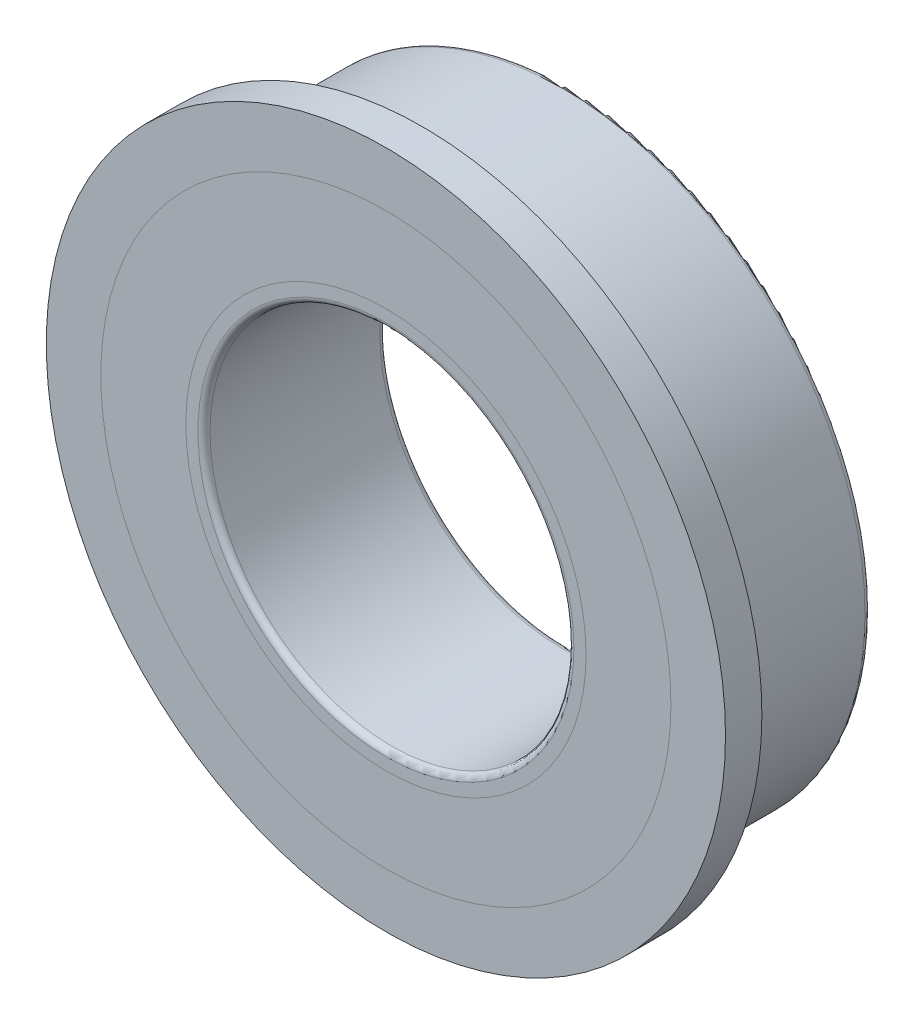
ISO-10303-21;
HEADER;
FILE_DESCRIPTION(('STEP AP214'),'2;1');
FILE_NAME('part.step','',(''),(''),'','','');
FILE_SCHEMA(('AUTOMOTIVE_DESIGN { 1 0 10303 214 1 1 1 1 }'));
ENDSEC;
DATA;
#1=APPLICATION_CONTEXT('core data for automotive mechanical design processes');
#2=APPLICATION_PROTOCOL_DEFINITION('international standard','automotive_design',2000,#1);
#3=PRODUCT_CONTEXT('',#1,'mechanical');
#4=PRODUCT('Part','Part','',(#3));
#5=PRODUCT_RELATED_PRODUCT_CATEGORY('part','',(#4));
#6=PRODUCT_DEFINITION_FORMATION('','',#4);
#7=PRODUCT_DEFINITION_CONTEXT('part definition',#1,'design');
#8=PRODUCT_DEFINITION('design','',#6,#7);
#9=PRODUCT_DEFINITION_SHAPE('','',#8);
#10=(LENGTH_UNIT() NAMED_UNIT(*) SI_UNIT(.MILLI.,.METRE.));
#11=(NAMED_UNIT(*) PLANE_ANGLE_UNIT() SI_UNIT($,.RADIAN.));
#12=(NAMED_UNIT(*) SI_UNIT($,.STERADIAN.) SOLID_ANGLE_UNIT());
#13=UNCERTAINTY_MEASURE_WITH_UNIT(LENGTH_MEASURE(1.E-05),#10,'distance_accuracy_value','');
#14=(GEOMETRIC_REPRESENTATION_CONTEXT(3) GLOBAL_UNCERTAINTY_ASSIGNED_CONTEXT((#13)) GLOBAL_UNIT_ASSIGNED_CONTEXT((#10,
#11,#12)) REPRESENTATION_CONTEXT('',''));
#15=CARTESIAN_POINT('',(0.,0.,0.));
#16=DIRECTION('',(0.,0.,1.));
#17=DIRECTION('',(1.,0.,0.));
#18=AXIS2_PLACEMENT_3D('',#15,#16,#17);
#19=CARTESIAN_POINT('',(0.,0.,0.));
#20=DIRECTION('',(0.,0.,1.));
#21=DIRECTION('',(1.,0.,0.));
#22=AXIS2_PLACEMENT_3D('',#19,#20,#21);
#23=PLANE('',#22);
#24=CARTESIAN_POINT('',(0.,0.,0.));
#25=DIRECTION('',(0.,0.,1.));
#26=DIRECTION('',(1.,0.,0.));
#27=AXIS2_PLACEMENT_3D('',#24,#25,#26);
#28=CIRCLE('',#27,4.9);
#29=CARTESIAN_POINT('',(4.9,0.,0.));
#30=VERTEX_POINT('',#29);
#31=EDGE_CURVE('E75',#30,#30,#28,.F.);
#32=ORIENTED_EDGE('',*,*,#31,.T.);
#33=EDGE_LOOP('',(#32));
#34=FACE_BOUND('',#33,.T.);
#35=CARTESIAN_POINT('',(0.,0.,0.));
#36=DIRECTION('',(0.,0.,1.));
#37=DIRECTION('',(1.,0.,0.));
#38=AXIS2_PLACEMENT_3D('',#35,#36,#37);
#39=CIRCLE('',#38,4.7);
#40=CARTESIAN_POINT('',(4.7,0.,0.));
#41=VERTEX_POINT('',#40);
#42=EDGE_CURVE('E10',#41,#41,#39,.F.);
#43=ORIENTED_EDGE('',*,*,#42,.F.);
#44=EDGE_LOOP('',(#43));
#45=FACE_BOUND('',#44,.T.);
#46=ADVANCED_FACE('F36',(#34,#45),#23,.F.);
#47=CARTESIAN_POINT('',(0.,0.,3.));
#48=DIRECTION('',(0.,0.,1.));
#49=DIRECTION('',(1.,0.,0.));
#50=AXIS2_PLACEMENT_3D('',#47,#48,#49);
#51=PLANE('',#50);
#52=CARTESIAN_POINT('',(0.,0.,3.));
#53=DIRECTION('',(0.,0.,1.));
#54=DIRECTION('',(1.,0.,0.));
#55=AXIS2_PLACEMENT_3D('',#52,#53,#54);
#56=CIRCLE('',#55,5.6);
#57=CARTESIAN_POINT('',(5.6,0.,3.));
#58=VERTEX_POINT('',#57);
#59=EDGE_CURVE('E82',#58,#58,#56,.T.);
#60=ORIENTED_EDGE('',*,*,#59,.T.);
#61=EDGE_LOOP('',(#60));
#62=FACE_BOUND('',#61,.T.);
#63=CARTESIAN_POINT('',(0.,0.,3.));
#64=DIRECTION('',(0.,0.,1.));
#65=DIRECTION('',(1.,0.,0.));
#66=AXIS2_PLACEMENT_3D('',#63,#64,#65);
#67=CIRCLE('',#66,4.7);
#68=CARTESIAN_POINT('',(4.7,0.,3.));
#69=VERTEX_POINT('',#68);
#70=EDGE_CURVE('E40',#69,#69,#67,.F.);
#71=ORIENTED_EDGE('',*,*,#70,.T.);
#72=EDGE_LOOP('',(#71));
#73=FACE_BOUND('',#72,.T.);
#74=ADVANCED_FACE('F111',(#62,#73),#51,.T.);
#75=ORIENTED_EDGE('',*,*,#42,.T.);
#76=EDGE_LOOP('',(#75));
#77=FACE_BOUND('',#76,.T.);
#78=CARTESIAN_POINT('',(0.,0.,0.));
#79=DIRECTION('',(0.,0.,1.));
#80=DIRECTION('',(1.,0.,0.));
#81=AXIS2_PLACEMENT_3D('',#78,#79,#80);
#82=CIRCLE('',#81,3.3);
#83=CARTESIAN_POINT('',(3.3,0.,0.));
#84=VERTEX_POINT('',#83);
#85=EDGE_CURVE('E52',#84,#84,#82,.F.);
#86=ORIENTED_EDGE('',*,*,#85,.F.);
#87=EDGE_LOOP('',(#86));
#88=FACE_BOUND('',#87,.T.);
#89=ADVANCED_FACE('F112',(#77,#88),#23,.F.);
#90=ORIENTED_EDGE('',*,*,#70,.F.);
#91=EDGE_LOOP('',(#90));
#92=FACE_BOUND('',#91,.T.);
#93=CARTESIAN_POINT('',(0.,0.,3.));
#94=DIRECTION('',(0.,0.,1.));
#95=DIRECTION('',(1.,0.,0.));
#96=AXIS2_PLACEMENT_3D('',#93,#94,#95);
#97=CIRCLE('',#96,3.3);
#98=CARTESIAN_POINT('',(3.3,0.,3.));
#99=VERTEX_POINT('',#98);
#100=EDGE_CURVE('E54',#99,#99,#97,.F.);
#101=ORIENTED_EDGE('',*,*,#100,.T.);
#102=EDGE_LOOP('',(#101));
#103=FACE_BOUND('',#102,.T.);
#104=ADVANCED_FACE('F101',(#92,#103),#51,.T.);
#105=CARTESIAN_POINT('',(0.,0.,3.));
#106=DIRECTION('',(0.,0.,-1.));
#107=DIRECTION('',(-1.,0.,0.));
#108=AXIS2_PLACEMENT_3D('',#105,#106,#107);
#109=CYLINDRICAL_SURFACE('',#108,5.);
#110=CARTESIAN_POINT('',(0.,0.,0.0999999999999998));
#111=DIRECTION('',(0.,0.,1.));
#112=DIRECTION('',(1.,0.,0.));
#113=AXIS2_PLACEMENT_3D('',#110,#111,#112);
#114=CIRCLE('',#113,5.);
#115=CARTESIAN_POINT('',(5.,0.,0.0999999999999998));
#116=VERTEX_POINT('',#115);
#117=EDGE_CURVE('E63',#116,#116,#114,.T.);
#118=ORIENTED_EDGE('',*,*,#117,.T.);
#119=EDGE_LOOP('',(#118));
#120=FACE_BOUND('',#119,.T.);
#121=CARTESIAN_POINT('',(0.,0.,2.4));
#122=DIRECTION('',(0.,0.,1.));
#123=DIRECTION('',(1.,0.,0.));
#124=AXIS2_PLACEMENT_3D('',#121,#122,#123);
#125=CIRCLE('',#124,5.);
#126=CARTESIAN_POINT('',(5.,0.,2.4));
#127=VERTEX_POINT('',#126);
#128=EDGE_CURVE('E78',#127,#127,#125,.T.);
#129=ORIENTED_EDGE('',*,*,#128,.F.);
#130=EDGE_LOOP('',(#129));
#131=FACE_BOUND('',#130,.T.);
#132=ADVANCED_FACE('F98',(#120,#131),#109,.T.);
#133=ORIENTED_EDGE('',*,*,#100,.F.);
#134=EDGE_LOOP('',(#133));
#135=FACE_BOUND('',#134,.T.);
#136=CARTESIAN_POINT('',(0.,0.,3.));
#137=DIRECTION('',(0.,0.,1.));
#138=DIRECTION('',(1.,0.,0.));
#139=AXIS2_PLACEMENT_3D('',#136,#137,#138);
#140=CIRCLE('',#139,3.1);
#141=CARTESIAN_POINT('',(3.1,0.,3.));
#142=VERTEX_POINT('',#141);
#143=EDGE_CURVE('E58',#142,#142,#140,.F.);
#144=ORIENTED_EDGE('',*,*,#143,.T.);
#145=EDGE_LOOP('',(#144));
#146=FACE_BOUND('',#145,.T.);
#147=ADVANCED_FACE('F100',(#135,#146),#51,.T.);
#148=ORIENTED_EDGE('',*,*,#85,.T.);
#149=EDGE_LOOP('',(#148));
#150=FACE_BOUND('',#149,.T.);
#151=CARTESIAN_POINT('',(0.,0.,0.));
#152=DIRECTION('',(0.,0.,1.));
#153=DIRECTION('',(1.,0.,0.));
#154=AXIS2_PLACEMENT_3D('',#151,#152,#153);
#155=CIRCLE('',#154,3.1);
#156=CARTESIAN_POINT('',(3.1,0.,0.));
#157=VERTEX_POINT('',#156);
#158=EDGE_CURVE('E72',#157,#157,#155,.T.);
#159=ORIENTED_EDGE('',*,*,#158,.T.);
#160=EDGE_LOOP('',(#159));
#161=FACE_BOUND('',#160,.T.);
#162=ADVANCED_FACE('F108',(#150,#161),#23,.F.);
#163=CARTESIAN_POINT('',(0.,0.,3.));
#164=DIRECTION('',(0.,0.,-1.));
#165=DIRECTION('',(-1.,0.,0.));
#166=AXIS2_PLACEMENT_3D('',#163,#164,#165);
#167=CYLINDRICAL_SURFACE('',#166,3.);
#168=CARTESIAN_POINT('',(0.,0.,0.0999999999999998));
#169=DIRECTION('',(0.,0.,1.));
#170=DIRECTION('',(1.,0.,0.));
#171=AXIS2_PLACEMENT_3D('',#168,#169,#170);
#172=CIRCLE('',#171,3.);
#173=CARTESIAN_POINT('',(3.,0.,0.0999999999999998));
#174=VERTEX_POINT('',#173);
#175=EDGE_CURVE('E66',#174,#174,#172,.F.);
#176=ORIENTED_EDGE('',*,*,#175,.T.);
#177=EDGE_LOOP('',(#176));
#178=FACE_BOUND('',#177,.T.);
#179=CARTESIAN_POINT('',(0.,0.,2.9));
#180=DIRECTION('',(0.,0.,1.));
#181=DIRECTION('',(1.,0.,0.));
#182=AXIS2_PLACEMENT_3D('',#179,#180,#181);
#183=CIRCLE('',#182,3.);
#184=CARTESIAN_POINT('',(3.,0.,2.9));
#185=VERTEX_POINT('',#184);
#186=EDGE_CURVE('E69',#185,#185,#183,.T.);
#187=ORIENTED_EDGE('',*,*,#186,.T.);
#188=EDGE_LOOP('',(#187));
#189=FACE_BOUND('',#188,.T.);
#190=ADVANCED_FACE('F94',(#178,#189),#167,.F.);
#191=CARTESIAN_POINT('',(0.,0.,2.4));
#192=DIRECTION('',(0.,0.,1.));
#193=DIRECTION('',(1.,0.,0.));
#194=AXIS2_PLACEMENT_3D('',#191,#192,#193);
#195=PLANE('',#194);
#196=CARTESIAN_POINT('',(0.,0.,2.4));
#197=DIRECTION('',(0.,0.,1.));
#198=DIRECTION('',(1.,0.,0.));
#199=AXIS2_PLACEMENT_3D('',#196,#197,#198);
#200=CIRCLE('',#199,5.6);
#201=CARTESIAN_POINT('',(5.6,0.,2.4));
#202=VERTEX_POINT('',#201);
#203=EDGE_CURVE('E81',#202,#202,#200,.T.);
#204=ORIENTED_EDGE('',*,*,#203,.F.);
#205=EDGE_LOOP('',(#204));
#206=FACE_BOUND('',#205,.T.);
#207=ORIENTED_EDGE('',*,*,#128,.T.);
#208=EDGE_LOOP('',(#207));
#209=FACE_BOUND('',#208,.T.);
#210=ADVANCED_FACE('F91',(#206,#209),#195,.F.);
#211=CARTESIAN_POINT('',(0.,0.,2.4));
#212=DIRECTION('',(0.,0.,1.));
#213=DIRECTION('',(1.,0.,0.));
#214=AXIS2_PLACEMENT_3D('',#211,#212,#213);
#215=CYLINDRICAL_SURFACE('',#214,5.6);
#216=ORIENTED_EDGE('',*,*,#203,.T.);
#217=EDGE_LOOP('',(#216));
#218=FACE_BOUND('',#217,.T.);
#219=ORIENTED_EDGE('',*,*,#59,.F.);
#220=EDGE_LOOP('',(#219));
#221=FACE_BOUND('',#220,.T.);
#222=ADVANCED_FACE('F88',(#218,#221),#215,.T.);
#223=CARTESIAN_POINT('',(0.,0.,0.0999999999999998));
#224=DIRECTION('',(0.,0.,1.));
#225=DIRECTION('',(1.,0.,0.));
#226=AXIS2_PLACEMENT_3D('',#223,#224,#225);
#227=TOROIDAL_SURFACE('',#226,3.1,0.1);
#228=ORIENTED_EDGE('',*,*,#175,.F.);
#229=EDGE_LOOP('',(#228));
#230=FACE_BOUND('',#229,.T.);
#231=ORIENTED_EDGE('',*,*,#158,.F.);
#232=EDGE_LOOP('',(#231));
#233=FACE_BOUND('',#232,.T.);
#234=ADVANCED_FACE('F135',(#230,#233),#227,.T.);
#235=CARTESIAN_POINT('',(0.,0.,0.0999999999999998));
#236=DIRECTION('',(0.,0.,1.));
#237=DIRECTION('',(1.,0.,0.));
#238=AXIS2_PLACEMENT_3D('',#235,#236,#237);
#239=TOROIDAL_SURFACE('',#238,4.9,0.1);
#240=ORIENTED_EDGE('',*,*,#31,.F.);
#241=EDGE_LOOP('',(#240));
#242=FACE_BOUND('',#241,.T.);
#243=ORIENTED_EDGE('',*,*,#117,.F.);
#244=EDGE_LOOP('',(#243));
#245=FACE_BOUND('',#244,.T.);
#246=ADVANCED_FACE('F137',(#242,#245),#239,.T.);
#247=CARTESIAN_POINT('',(0.,0.,2.9));
#248=DIRECTION('',(0.,0.,1.));
#249=DIRECTION('',(1.,0.,0.));
#250=AXIS2_PLACEMENT_3D('',#247,#248,#249);
#251=TOROIDAL_SURFACE('',#250,3.1,0.1);
#252=ORIENTED_EDGE('',*,*,#143,.F.);
#253=EDGE_LOOP('',(#252));
#254=FACE_BOUND('',#253,.T.);
#255=ORIENTED_EDGE('',*,*,#186,.F.);
#256=EDGE_LOOP('',(#255));
#257=FACE_BOUND('',#256,.T.);
#258=ADVANCED_FACE('F38',(#254,#257),#251,.T.);
#259=CLOSED_SHELL('',(#46,#74,#89,#104,#132,#147,#162,#190,#210,#222,#234,#246,#258));
#260=MANIFOLD_SOLID_BREP('B2',#259);
#261=ADVANCED_BREP_SHAPE_REPRESENTATION('',(#18,#260),#14);
#262=SHAPE_DEFINITION_REPRESENTATION(#9,#261);
ENDSEC;
END-ISO-10303-21;
